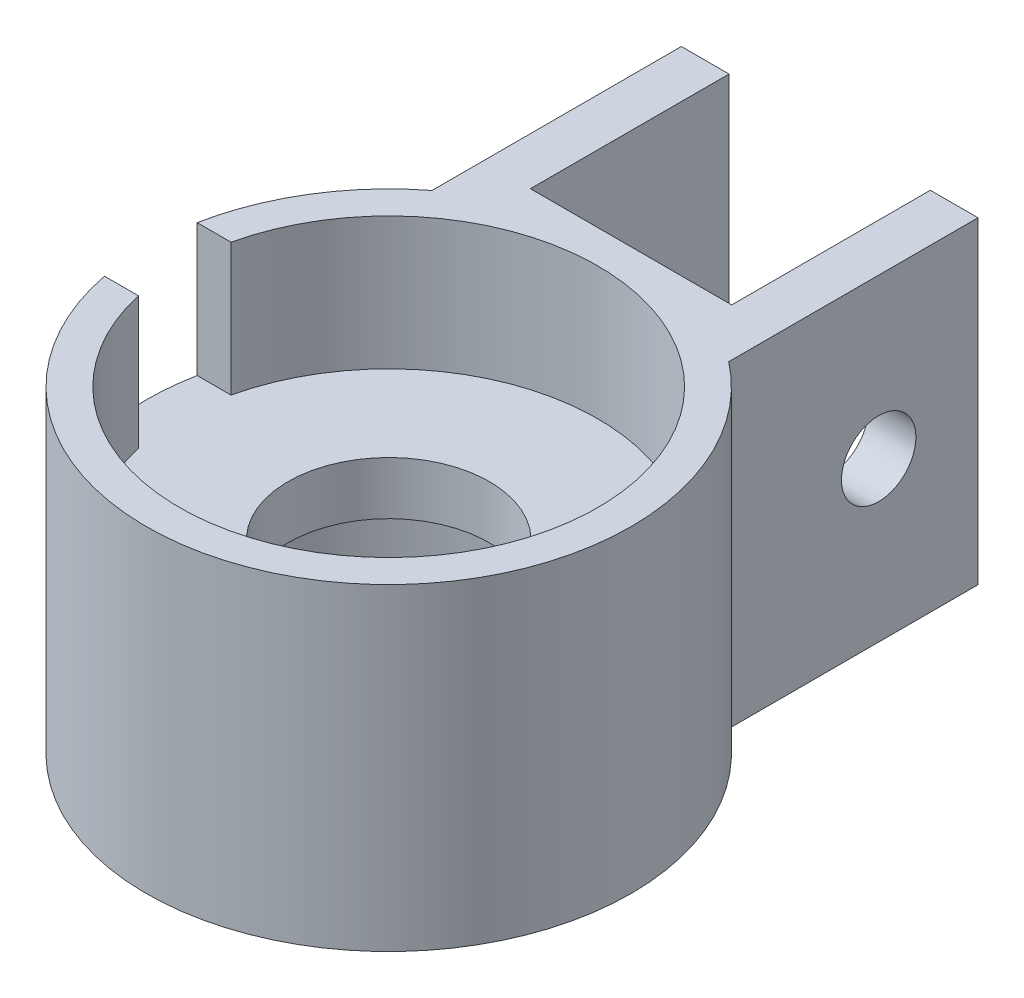
ISO-10303-21;
HEADER;
FILE_DESCRIPTION(('STEP AP214'),'2;1');
FILE_NAME('part.step','',(''),(''),'','','');
FILE_SCHEMA(('AUTOMOTIVE_DESIGN { 1 0 10303 214 1 1 1 1 }'));
ENDSEC;
DATA;
#1=APPLICATION_CONTEXT('core data for automotive mechanical design processes');
#2=APPLICATION_PROTOCOL_DEFINITION('international standard','automotive_design',2000,#1);
#3=PRODUCT_CONTEXT('',#1,'mechanical');
#4=PRODUCT('Part','Part','',(#3));
#5=PRODUCT_RELATED_PRODUCT_CATEGORY('part','',(#4));
#6=PRODUCT_DEFINITION_FORMATION('','',#4);
#7=PRODUCT_DEFINITION_CONTEXT('part definition',#1,'design');
#8=PRODUCT_DEFINITION('design','',#6,#7);
#9=PRODUCT_DEFINITION_SHAPE('','',#8);
#10=(LENGTH_UNIT() NAMED_UNIT(*) SI_UNIT(.MILLI.,.METRE.));
#11=(NAMED_UNIT(*) PLANE_ANGLE_UNIT() SI_UNIT($,.RADIAN.));
#12=(NAMED_UNIT(*) SI_UNIT($,.STERADIAN.) SOLID_ANGLE_UNIT());
#13=UNCERTAINTY_MEASURE_WITH_UNIT(LENGTH_MEASURE(1.E-05),#10,'distance_accuracy_value','');
#14=(GEOMETRIC_REPRESENTATION_CONTEXT(3) GLOBAL_UNCERTAINTY_ASSIGNED_CONTEXT((#13)) GLOBAL_UNIT_ASSIGNED_CONTEXT((#10,
#11,#12)) REPRESENTATION_CONTEXT('',''));
#15=CARTESIAN_POINT('',(0.,0.,0.));
#16=DIRECTION('',(0.,0.,1.));
#17=DIRECTION('',(1.,0.,0.));
#18=AXIS2_PLACEMENT_3D('',#15,#16,#17);
#19=CARTESIAN_POINT('',(0.,5.08,0.));
#20=DIRECTION('',(0.,1.,0.));
#21=DIRECTION('',(0.,0.,1.));
#22=AXIS2_PLACEMENT_3D('',#19,#20,#21);
#23=PLANE('',#22);
#24=DIRECTION('',(-1.,0.,0.));
#25=VECTOR('',#24,1.);
#26=CARTESIAN_POINT('',(0.,5.08,4.445));
#27=LINE('',#26,#25);
#28=CARTESIAN_POINT('',(-19.5674814679866,5.07999999999997,4.445));
#29=VERTEX_POINT('',#28);
#30=CARTESIAN_POINT('',(-22.8119717692268,5.07999999999997,4.44499999999998));
#31=VERTEX_POINT('',#30);
#32=EDGE_CURVE('E268',#29,#31,#27,.T.);
#33=ORIENTED_EDGE('',*,*,#32,.F.);
#34=CARTESIAN_POINT('',(0.,5.08,0.));
#35=DIRECTION('',(0.,1.,0.));
#36=DIRECTION('',(0.,0.,1.));
#37=AXIS2_PLACEMENT_3D('',#34,#35,#36);
#38=CIRCLE('',#37,20.066);
#39=CARTESIAN_POINT('',(-19.5674814679866,5.07999999999997,-4.445));
#40=VERTEX_POINT('',#39);
#41=EDGE_CURVE('E56',#40,#29,#38,.F.);
#42=ORIENTED_EDGE('',*,*,#41,.F.);
#43=DIRECTION('',(1.,0.,0.));
#44=VECTOR('',#43,1.);
#45=CARTESIAN_POINT('',(0.,5.08,-4.445));
#46=LINE('',#45,#44);
#47=CARTESIAN_POINT('',(-22.8119717692268,5.07999999999997,-4.445));
#48=VERTEX_POINT('',#47);
#49=EDGE_CURVE('E265',#48,#40,#46,.T.);
#50=ORIENTED_EDGE('',*,*,#49,.F.);
#51=CARTESIAN_POINT('',(0.,5.08,0.));
#52=DIRECTION('',(0.,1.,0.));
#53=DIRECTION('',(0.,0.,1.));
#54=AXIS2_PLACEMENT_3D('',#51,#52,#53);
#55=CIRCLE('',#54,23.241);
#56=EDGE_CURVE('E163',#48,#31,#55,.T.);
#57=ORIENTED_EDGE('',*,*,#56,.T.);
#58=EDGE_LOOP('',(#33,#42,#50,#57));
#59=FACE_BOUND('',#58,.T.);
#60=CARTESIAN_POINT('',(0.,5.08,0.));
#61=DIRECTION('',(0.,1.,0.));
#62=DIRECTION('',(0.,0.,1.));
#63=AXIS2_PLACEMENT_3D('',#60,#61,#62);
#64=CIRCLE('',#63,9.652);
#65=CARTESIAN_POINT('',(0.,5.08,9.652));
#66=VERTEX_POINT('',#65);
#67=EDGE_CURVE('E272',#66,#66,#64,.T.);
#68=ORIENTED_EDGE('',*,*,#67,.F.);
#69=EDGE_LOOP('',(#68));
#70=FACE_BOUND('',#69,.T.);
#71=ADVANCED_FACE('F41',(#59,#70),#23,.T.);
#72=CARTESIAN_POINT('',(0.,0.,0.));
#73=DIRECTION('',(0.,1.,0.));
#74=DIRECTION('',(0.,0.,1.));
#75=AXIS2_PLACEMENT_3D('',#72,#73,#74);
#76=PLANE('',#75);
#77=CARTESIAN_POINT('',(0.,0.,0.));
#78=DIRECTION('',(0.,1.,0.));
#79=DIRECTION('',(0.,0.,1.));
#80=AXIS2_PLACEMENT_3D('',#77,#78,#79);
#81=CIRCLE('',#80,20.066);
#82=CARTESIAN_POINT('',(-19.5674814679866,0.,-4.445));
#83=VERTEX_POINT('',#82);
#84=CARTESIAN_POINT('',(-19.5674814679866,0.,4.445));
#85=VERTEX_POINT('',#84);
#86=EDGE_CURVE('E12',#83,#85,#81,.F.);
#87=ORIENTED_EDGE('',*,*,#86,.T.);
#88=DIRECTION('',(-1.,0.,0.));
#89=VECTOR('',#88,1.);
#90=CARTESIAN_POINT('',(0.,0.,4.445));
#91=LINE('',#90,#89);
#92=CARTESIAN_POINT('',(-22.8119717692268,0.,4.44499999999998));
#93=VERTEX_POINT('',#92);
#94=EDGE_CURVE('E64',#85,#93,#91,.T.);
#95=ORIENTED_EDGE('',*,*,#94,.T.);
#96=CARTESIAN_POINT('',(0.,0.,0.));
#97=DIRECTION('',(0.,1.,0.));
#98=DIRECTION('',(0.,0.,1.));
#99=AXIS2_PLACEMENT_3D('',#96,#97,#98);
#100=CIRCLE('',#99,23.241);
#101=CARTESIAN_POINT('',(-22.8119717692268,0.,-4.445));
#102=VERTEX_POINT('',#101);
#103=EDGE_CURVE('E275',#102,#93,#100,.T.);
#104=ORIENTED_EDGE('',*,*,#103,.F.);
#105=DIRECTION('',(1.,0.,0.));
#106=VECTOR('',#105,1.);
#107=CARTESIAN_POINT('',(0.,0.,-4.445));
#108=LINE('',#107,#106);
#109=EDGE_CURVE('E262',#102,#83,#108,.T.);
#110=ORIENTED_EDGE('',*,*,#109,.T.);
#111=EDGE_LOOP('',(#87,#95,#104,#110));
#112=FACE_BOUND('',#111,.T.);
#113=CARTESIAN_POINT('',(0.,0.,0.));
#114=DIRECTION('',(0.,1.,0.));
#115=DIRECTION('',(0.,0.,1.));
#116=AXIS2_PLACEMENT_3D('',#113,#114,#115);
#117=CIRCLE('',#116,9.652);
#118=CARTESIAN_POINT('',(0.,0.,9.652));
#119=VERTEX_POINT('',#118);
#120=EDGE_CURVE('E271',#119,#119,#117,.T.);
#121=ORIENTED_EDGE('',*,*,#120,.T.);
#122=EDGE_LOOP('',(#121));
#123=FACE_BOUND('',#122,.T.);
#124=ADVANCED_FACE('F344',(#112,#123),#76,.F.);
#125=CARTESIAN_POINT('',(0.,5.08,0.));
#126=DIRECTION('',(0.,-1.,0.));
#127=DIRECTION('',(0.,0.,-1.));
#128=AXIS2_PLACEMENT_3D('',#125,#126,#127);
#129=CYLINDRICAL_SURFACE('',#128,23.241);
#130=ORIENTED_EDGE('',*,*,#103,.T.);
#131=DIRECTION('',(0.,1.,0.));
#132=VECTOR('',#131,1.);
#133=CARTESIAN_POINT('',(-22.8119717692268,-105.495687978675,4.44499999999998));
#134=LINE('',#133,#132);
#135=CARTESIAN_POINT('',(-22.8119717692268,-12.7,4.445));
#136=VERTEX_POINT('',#135);
#137=EDGE_CURVE('E251',#136,#93,#134,.T.);
#138=ORIENTED_EDGE('',*,*,#137,.F.);
#139=CARTESIAN_POINT('',(0.,-12.7,0.));
#140=DIRECTION('',(0.,1.,0.));
#141=DIRECTION('',(0.,0.,1.));
#142=AXIS2_PLACEMENT_3D('',#139,#140,#141);
#143=CIRCLE('',#142,23.241);
#144=CARTESIAN_POINT('',(14.224,-12.7,-18.379932127187));
#145=VERTEX_POINT('',#144);
#146=EDGE_CURVE('E219',#145,#136,#143,.F.);
#147=ORIENTED_EDGE('',*,*,#146,.F.);
#148=DIRECTION('',(0.,-1.,0.));
#149=VECTOR('',#148,1.);
#150=CARTESIAN_POINT('',(14.224,5.08,-18.379932127187));
#151=LINE('',#150,#149);
#152=CARTESIAN_POINT('',(14.224,17.78,-18.379932127187));
#153=VERTEX_POINT('',#152);
#154=EDGE_CURVE('E279',#145,#153,#151,.F.);
#155=ORIENTED_EDGE('',*,*,#154,.T.);
#156=CARTESIAN_POINT('',(0.,17.78,0.));
#157=DIRECTION('',(0.,1.,0.));
#158=DIRECTION('',(0.,0.,1.));
#159=AXIS2_PLACEMENT_3D('',#156,#157,#158);
#160=CIRCLE('',#159,23.241);
#161=CARTESIAN_POINT('',(-22.8119717692268,17.78,4.44499999999998));
#162=VERTEX_POINT('',#161);
#163=EDGE_CURVE('E193',#162,#153,#160,.T.);
#164=ORIENTED_EDGE('',*,*,#163,.F.);
#165=EDGE_CURVE('E253',#31,#162,#134,.T.);
#166=ORIENTED_EDGE('',*,*,#165,.F.);
#167=ORIENTED_EDGE('',*,*,#56,.F.);
#168=DIRECTION('',(0.,1.,0.));
#169=VECTOR('',#168,1.);
#170=CARTESIAN_POINT('',(-22.8119717692268,-105.495687978675,-4.445));
#171=LINE('',#170,#169);
#172=CARTESIAN_POINT('',(-22.8119717692268,17.78,-4.445));
#173=VERTEX_POINT('',#172);
#174=EDGE_CURVE('E156',#48,#173,#171,.T.);
#175=ORIENTED_EDGE('',*,*,#174,.T.);
#176=CARTESIAN_POINT('',(0.,17.78,0.));
#177=DIRECTION('',(0.,1.,0.));
#178=DIRECTION('',(0.,0.,1.));
#179=AXIS2_PLACEMENT_3D('',#176,#177,#178);
#180=CIRCLE('',#179,23.241);
#181=CARTESIAN_POINT('',(-14.224,17.78,-18.379932127187));
#182=VERTEX_POINT('',#181);
#183=EDGE_CURVE('E160',#182,#173,#180,.T.);
#184=ORIENTED_EDGE('',*,*,#183,.F.);
#185=DIRECTION('',(0.,-1.,0.));
#186=VECTOR('',#185,1.);
#187=CARTESIAN_POINT('',(-14.224,5.08,-18.379932127187));
#188=LINE('',#187,#186);
#189=CARTESIAN_POINT('',(-14.224,-12.7,-18.379932127187));
#190=VERTEX_POINT('',#189);
#191=EDGE_CURVE('E49',#182,#190,#188,.T.);
#192=ORIENTED_EDGE('',*,*,#191,.T.);
#193=CARTESIAN_POINT('',(0.,-12.7,0.));
#194=DIRECTION('',(0.,1.,0.));
#195=DIRECTION('',(0.,0.,1.));
#196=AXIS2_PLACEMENT_3D('',#193,#194,#195);
#197=CIRCLE('',#196,23.241);
#198=CARTESIAN_POINT('',(-22.8119717692268,-12.7,-4.445));
#199=VERTEX_POINT('',#198);
#200=EDGE_CURVE('E236',#199,#190,#197,.F.);
#201=ORIENTED_EDGE('',*,*,#200,.F.);
#202=EDGE_CURVE('E166',#199,#102,#171,.T.);
#203=ORIENTED_EDGE('',*,*,#202,.T.);
#204=EDGE_LOOP('',(#130,#138,#147,#155,#164,#166,#167,#175,#184,#192,#201,#203));
#205=FACE_BOUND('',#204,.T.);
#206=ADVANCED_FACE('F43',(#205),#129,.T.);
#207=CARTESIAN_POINT('',(0.,5.08,0.));
#208=DIRECTION('',(0.,-1.,0.));
#209=DIRECTION('',(0.,0.,-1.));
#210=AXIS2_PLACEMENT_3D('',#207,#208,#209);
#211=CYLINDRICAL_SURFACE('',#210,9.652);
#212=ORIENTED_EDGE('',*,*,#67,.T.);
#213=EDGE_LOOP('',(#212));
#214=FACE_BOUND('',#213,.T.);
#215=ORIENTED_EDGE('',*,*,#120,.F.);
#216=EDGE_LOOP('',(#215));
#217=FACE_BOUND('',#216,.T.);
#218=ADVANCED_FACE('F341',(#214,#217),#211,.F.);
#219=CARTESIAN_POINT('',(0.,-105.495687978675,0.));
#220=DIRECTION('',(0.,1.,0.));
#221=DIRECTION('',(0.,0.,1.));
#222=AXIS2_PLACEMENT_3D('',#219,#220,#221);
#223=CYLINDRICAL_SURFACE('',#222,20.066);
#224=ORIENTED_EDGE('',*,*,#86,.F.);
#225=DIRECTION('',(0.,1.,0.));
#226=VECTOR('',#225,1.);
#227=CARTESIAN_POINT('',(-19.5674814679866,-105.495687978675,-4.445));
#228=LINE('',#227,#226);
#229=CARTESIAN_POINT('',(-19.5674814679866,-12.7,-4.445));
#230=VERTEX_POINT('',#229);
#231=EDGE_CURVE('E257',#230,#83,#228,.T.);
#232=ORIENTED_EDGE('',*,*,#231,.F.);
#233=CARTESIAN_POINT('',(0.,-12.7,0.));
#234=DIRECTION('',(0.,1.,0.));
#235=DIRECTION('',(0.,0.,1.));
#236=AXIS2_PLACEMENT_3D('',#233,#234,#235);
#237=CIRCLE('',#236,20.066);
#238=CARTESIAN_POINT('',(-19.5674814679866,-12.7,4.445));
#239=VERTEX_POINT('',#238);
#240=EDGE_CURVE('E214',#239,#230,#237,.T.);
#241=ORIENTED_EDGE('',*,*,#240,.F.);
#242=DIRECTION('',(0.,1.,0.));
#243=VECTOR('',#242,1.);
#244=CARTESIAN_POINT('',(-19.5674814679866,-105.495687978675,4.445));
#245=LINE('',#244,#243);
#246=EDGE_CURVE('E254',#239,#85,#245,.T.);
#247=ORIENTED_EDGE('',*,*,#246,.T.);
#248=EDGE_LOOP('',(#224,#232,#241,#247));
#249=FACE_BOUND('',#248,.T.);
#250=ADVANCED_FACE('F331',(#249),#223,.F.);
#251=CARTESIAN_POINT('',(-22.8119717692268,-105.495687978675,4.445));
#252=DIRECTION('',(0.,0.,-1.));
#253=DIRECTION('',(-1.,0.,0.));
#254=AXIS2_PLACEMENT_3D('',#251,#252,#253);
#255=PLANE('',#254);
#256=ORIENTED_EDGE('',*,*,#94,.F.);
#257=ORIENTED_EDGE('',*,*,#246,.F.);
#258=DIRECTION('',(1.,0.,0.));
#259=VECTOR('',#258,1.);
#260=CARTESIAN_POINT('',(-22.8119717692268,-12.7,4.445));
#261=LINE('',#260,#259);
#262=EDGE_CURVE('E216',#136,#239,#261,.T.);
#263=ORIENTED_EDGE('',*,*,#262,.F.);
#264=ORIENTED_EDGE('',*,*,#137,.T.);
#265=EDGE_LOOP('',(#256,#257,#263,#264));
#266=FACE_BOUND('',#265,.T.);
#267=ADVANCED_FACE('F339',(#266),#255,.T.);
#268=CARTESIAN_POINT('',(-22.8119717692268,-105.495687978675,-4.445));
#269=DIRECTION('',(0.,0.,1.));
#270=DIRECTION('',(1.,0.,0.));
#271=AXIS2_PLACEMENT_3D('',#268,#269,#270);
#272=PLANE('',#271);
#273=ORIENTED_EDGE('',*,*,#109,.F.);
#274=ORIENTED_EDGE('',*,*,#202,.F.);
#275=DIRECTION('',(-1.,0.,0.));
#276=VECTOR('',#275,1.);
#277=CARTESIAN_POINT('',(-22.8119717692268,-12.7,-4.445));
#278=LINE('',#277,#276);
#279=EDGE_CURVE('E239',#230,#199,#278,.T.);
#280=ORIENTED_EDGE('',*,*,#279,.F.);
#281=ORIENTED_EDGE('',*,*,#231,.T.);
#282=EDGE_LOOP('',(#273,#274,#280,#281));
#283=FACE_BOUND('',#282,.T.);
#284=ADVANCED_FACE('F337',(#283),#272,.T.);
#285=CARTESIAN_POINT('',(-14.224,-105.495687978675,-18.379932127187));
#286=DIRECTION('',(-1.,0.,0.));
#287=DIRECTION('',(0.,0.,1.));
#288=AXIS2_PLACEMENT_3D('',#285,#286,#287);
#289=PLANE('',#288);
#290=CARTESIAN_POINT('',(-14.224,2.54,-32.766));
#291=DIRECTION('',(-1.,0.,0.));
#292=DIRECTION('',(0.,0.,1.));
#293=AXIS2_PLACEMENT_3D('',#290,#291,#292);
#294=CIRCLE('',#293,3.57123999999999);
#295=CARTESIAN_POINT('',(-14.224,2.54,-29.19476));
#296=VERTEX_POINT('',#295);
#297=EDGE_CURVE('E182',#296,#296,#294,.T.);
#298=ORIENTED_EDGE('',*,*,#297,.F.);
#299=EDGE_LOOP('',(#298));
#300=FACE_BOUND('',#299,.T.);
#301=DIRECTION('',(0.,0.,-1.));
#302=VECTOR('',#301,1.);
#303=CARTESIAN_POINT('',(-14.224,-12.7,-18.379932127187));
#304=LINE('',#303,#302);
#305=CARTESIAN_POINT('',(-14.224,-12.7,-42.291));
#306=VERTEX_POINT('',#305);
#307=EDGE_CURVE('E234',#190,#306,#304,.T.);
#308=ORIENTED_EDGE('',*,*,#307,.F.);
#309=ORIENTED_EDGE('',*,*,#191,.F.);
#310=DIRECTION('',(0.,0.,1.));
#311=VECTOR('',#310,1.);
#312=CARTESIAN_POINT('',(-14.224,17.78,-18.379932127187));
#313=LINE('',#312,#311);
#314=CARTESIAN_POINT('',(-14.224,17.78,-42.291));
#315=VERTEX_POINT('',#314);
#316=EDGE_CURVE('E167',#315,#182,#313,.T.);
#317=ORIENTED_EDGE('',*,*,#316,.F.);
#318=DIRECTION('',(0.,1.,0.));
#319=VECTOR('',#318,1.);
#320=CARTESIAN_POINT('',(-14.224,-105.495687978675,-42.291));
#321=LINE('',#320,#319);
#322=EDGE_CURVE('E217',#306,#315,#321,.T.);
#323=ORIENTED_EDGE('',*,*,#322,.F.);
#324=EDGE_LOOP('',(#308,#309,#317,#323));
#325=FACE_BOUND('',#324,.T.);
#326=ADVANCED_FACE('F290',(#300,#325),#289,.T.);
#327=CARTESIAN_POINT('',(-14.224,-105.495687978675,-42.291));
#328=DIRECTION('',(0.,0.,-1.));
#329=DIRECTION('',(-1.,0.,0.));
#330=AXIS2_PLACEMENT_3D('',#327,#328,#329);
#331=PLANE('',#330);
#332=DIRECTION('',(1.,0.,0.));
#333=VECTOR('',#332,1.);
#334=CARTESIAN_POINT('',(-14.224,-12.7,-42.291));
#335=LINE('',#334,#333);
#336=CARTESIAN_POINT('',(-9.652,-12.7,-42.291));
#337=VERTEX_POINT('',#336);
#338=EDGE_CURVE('E232',#306,#337,#335,.T.);
#339=ORIENTED_EDGE('',*,*,#338,.F.);
#340=ORIENTED_EDGE('',*,*,#322,.T.);
#341=DIRECTION('',(-1.,0.,0.));
#342=VECTOR('',#341,1.);
#343=CARTESIAN_POINT('',(-14.224,17.78,-42.291));
#344=LINE('',#343,#342);
#345=CARTESIAN_POINT('',(-9.652,17.78,-42.291));
#346=VERTEX_POINT('',#345);
#347=EDGE_CURVE('E211',#346,#315,#344,.T.);
#348=ORIENTED_EDGE('',*,*,#347,.F.);
#349=DIRECTION('',(0.,1.,0.));
#350=VECTOR('',#349,1.);
#351=CARTESIAN_POINT('',(-9.652,-105.495687978675,-42.291));
#352=LINE('',#351,#350);
#353=EDGE_CURVE('E241',#337,#346,#352,.T.);
#354=ORIENTED_EDGE('',*,*,#353,.F.);
#355=EDGE_LOOP('',(#339,#340,#348,#354));
#356=FACE_BOUND('',#355,.T.);
#357=ADVANCED_FACE('F293',(#356),#331,.T.);
#358=CARTESIAN_POINT('',(-9.652,-105.495687978675,-42.291));
#359=DIRECTION('',(1.,0.,0.));
#360=DIRECTION('',(0.,0.,-1.));
#361=AXIS2_PLACEMENT_3D('',#358,#359,#360);
#362=PLANE('',#361);
#363=CARTESIAN_POINT('',(-9.652,2.54,-32.766));
#364=DIRECTION('',(1.,0.,0.));
#365=DIRECTION('',(0.,0.,-1.));
#366=AXIS2_PLACEMENT_3D('',#363,#364,#365);
#367=CIRCLE('',#366,3.57123999999999);
#368=CARTESIAN_POINT('',(-9.652,2.54,-36.33724));
#369=VERTEX_POINT('',#368);
#370=EDGE_CURVE('E185',#369,#369,#367,.T.);
#371=ORIENTED_EDGE('',*,*,#370,.F.);
#372=EDGE_LOOP('',(#371));
#373=FACE_BOUND('',#372,.T.);
#374=DIRECTION('',(0.,0.,1.));
#375=VECTOR('',#374,1.);
#376=CARTESIAN_POINT('',(-9.652,-12.7,-42.291));
#377=LINE('',#376,#375);
#378=CARTESIAN_POINT('',(-9.652,-12.7,-23.241));
#379=VERTEX_POINT('',#378);
#380=EDGE_CURVE('E230',#337,#379,#377,.T.);
#381=ORIENTED_EDGE('',*,*,#380,.F.);
#382=ORIENTED_EDGE('',*,*,#353,.T.);
#383=DIRECTION('',(0.,0.,-1.));
#384=VECTOR('',#383,1.);
#385=CARTESIAN_POINT('',(-9.652,17.78,-42.291));
#386=LINE('',#385,#384);
#387=CARTESIAN_POINT('',(-9.652,17.78,-23.241));
#388=VERTEX_POINT('',#387);
#389=EDGE_CURVE('E208',#388,#346,#386,.T.);
#390=ORIENTED_EDGE('',*,*,#389,.F.);
#391=DIRECTION('',(0.,1.,0.));
#392=VECTOR('',#391,1.);
#393=CARTESIAN_POINT('',(-9.652,-105.495687978675,-23.241));
#394=LINE('',#393,#392);
#395=EDGE_CURVE('E243',#379,#388,#394,.T.);
#396=ORIENTED_EDGE('',*,*,#395,.F.);
#397=EDGE_LOOP('',(#381,#382,#390,#396));
#398=FACE_BOUND('',#397,.T.);
#399=ADVANCED_FACE('F300',(#373,#398),#362,.T.);
#400=CARTESIAN_POINT('',(-9.652,-105.495687978675,-23.241));
#401=DIRECTION('',(0.,0.,-1.));
#402=DIRECTION('',(-1.,0.,0.));
#403=AXIS2_PLACEMENT_3D('',#400,#401,#402);
#404=PLANE('',#403);
#405=DIRECTION('',(1.,0.,0.));
#406=VECTOR('',#405,1.);
#407=CARTESIAN_POINT('',(-9.652,-12.7,-23.241));
#408=LINE('',#407,#406);
#409=CARTESIAN_POINT('',(9.652,-12.7,-23.241));
#410=VERTEX_POINT('',#409);
#411=EDGE_CURVE('E228',#379,#410,#408,.T.);
#412=ORIENTED_EDGE('',*,*,#411,.F.);
#413=ORIENTED_EDGE('',*,*,#395,.T.);
#414=DIRECTION('',(-1.,0.,0.));
#415=VECTOR('',#414,1.);
#416=CARTESIAN_POINT('',(-9.652,17.78,-23.241));
#417=LINE('',#416,#415);
#418=CARTESIAN_POINT('',(9.652,17.78,-23.241));
#419=VERTEX_POINT('',#418);
#420=EDGE_CURVE('E205',#419,#388,#417,.T.);
#421=ORIENTED_EDGE('',*,*,#420,.F.);
#422=DIRECTION('',(0.,1.,0.));
#423=VECTOR('',#422,1.);
#424=CARTESIAN_POINT('',(9.652,-105.495687978675,-23.241));
#425=LINE('',#424,#423);
#426=EDGE_CURVE('E245',#410,#419,#425,.T.);
#427=ORIENTED_EDGE('',*,*,#426,.F.);
#428=EDGE_LOOP('',(#412,#413,#421,#427));
#429=FACE_BOUND('',#428,.T.);
#430=ADVANCED_FACE('F305',(#429),#404,.T.);
#431=CARTESIAN_POINT('',(9.652,-105.495687978675,-23.241));
#432=DIRECTION('',(-1.,0.,0.));
#433=DIRECTION('',(0.,0.,1.));
#434=AXIS2_PLACEMENT_3D('',#431,#432,#433);
#435=PLANE('',#434);
#436=CARTESIAN_POINT('',(9.652,2.54,-32.766));
#437=DIRECTION('',(-1.,0.,0.));
#438=DIRECTION('',(0.,0.,1.));
#439=AXIS2_PLACEMENT_3D('',#436,#437,#438);
#440=CIRCLE('',#439,3.57123999999999);
#441=CARTESIAN_POINT('',(9.652,2.54,-29.19476));
#442=VERTEX_POINT('',#441);
#443=EDGE_CURVE('E488',#442,#442,#440,.T.);
#444=ORIENTED_EDGE('',*,*,#443,.F.);
#445=EDGE_LOOP('',(#444));
#446=FACE_BOUND('',#445,.T.);
#447=DIRECTION('',(0.,0.,-1.));
#448=VECTOR('',#447,1.);
#449=CARTESIAN_POINT('',(9.652,-12.7,-23.241));
#450=LINE('',#449,#448);
#451=CARTESIAN_POINT('',(9.652,-12.7,-42.291));
#452=VERTEX_POINT('',#451);
#453=EDGE_CURVE('E226',#410,#452,#450,.T.);
#454=ORIENTED_EDGE('',*,*,#453,.F.);
#455=ORIENTED_EDGE('',*,*,#426,.T.);
#456=DIRECTION('',(0.,0.,1.));
#457=VECTOR('',#456,1.);
#458=CARTESIAN_POINT('',(9.652,17.78,-23.241));
#459=LINE('',#458,#457);
#460=CARTESIAN_POINT('',(9.652,17.78,-42.291));
#461=VERTEX_POINT('',#460);
#462=EDGE_CURVE('E202',#461,#419,#459,.T.);
#463=ORIENTED_EDGE('',*,*,#462,.F.);
#464=DIRECTION('',(0.,1.,0.));
#465=VECTOR('',#464,1.);
#466=CARTESIAN_POINT('',(9.652,-105.495687978675,-42.291));
#467=LINE('',#466,#465);
#468=EDGE_CURVE('E247',#452,#461,#467,.T.);
#469=ORIENTED_EDGE('',*,*,#468,.F.);
#470=EDGE_LOOP('',(#454,#455,#463,#469));
#471=FACE_BOUND('',#470,.T.);
#472=ADVANCED_FACE('F308',(#446,#471),#435,.T.);
#473=CARTESIAN_POINT('',(9.652,-105.495687978675,-42.291));
#474=DIRECTION('',(0.,0.,-1.));
#475=DIRECTION('',(-1.,0.,0.));
#476=AXIS2_PLACEMENT_3D('',#473,#474,#475);
#477=PLANE('',#476);
#478=DIRECTION('',(1.,0.,0.));
#479=VECTOR('',#478,1.);
#480=CARTESIAN_POINT('',(9.652,-12.7,-42.291));
#481=LINE('',#480,#479);
#482=CARTESIAN_POINT('',(14.224,-12.7,-42.291));
#483=VERTEX_POINT('',#482);
#484=EDGE_CURVE('E224',#452,#483,#481,.T.);
#485=ORIENTED_EDGE('',*,*,#484,.F.);
#486=ORIENTED_EDGE('',*,*,#468,.T.);
#487=DIRECTION('',(-1.,0.,0.));
#488=VECTOR('',#487,1.);
#489=CARTESIAN_POINT('',(9.652,17.78,-42.291));
#490=LINE('',#489,#488);
#491=CARTESIAN_POINT('',(14.224,17.78,-42.291));
#492=VERTEX_POINT('',#491);
#493=EDGE_CURVE('E199',#492,#461,#490,.T.);
#494=ORIENTED_EDGE('',*,*,#493,.F.);
#495=DIRECTION('',(0.,1.,0.));
#496=VECTOR('',#495,1.);
#497=CARTESIAN_POINT('',(14.224,-105.495687978675,-42.291));
#498=LINE('',#497,#496);
#499=EDGE_CURVE('E249',#483,#492,#498,.T.);
#500=ORIENTED_EDGE('',*,*,#499,.F.);
#501=EDGE_LOOP('',(#485,#486,#494,#500));
#502=FACE_BOUND('',#501,.T.);
#503=ADVANCED_FACE('F315',(#502),#477,.T.);
#504=CARTESIAN_POINT('',(14.224,-105.495687978675,-42.291));
#505=DIRECTION('',(1.,0.,0.));
#506=DIRECTION('',(0.,0.,-1.));
#507=AXIS2_PLACEMENT_3D('',#504,#505,#506);
#508=PLANE('',#507);
#509=CARTESIAN_POINT('',(14.224,2.54,-32.766));
#510=DIRECTION('',(1.,0.,0.));
#511=DIRECTION('',(0.,0.,-1.));
#512=AXIS2_PLACEMENT_3D('',#509,#510,#511);
#513=CIRCLE('',#512,3.57123999999999);
#514=CARTESIAN_POINT('',(14.224,2.54,-36.33724));
#515=VERTEX_POINT('',#514);
#516=EDGE_CURVE('E486',#515,#515,#513,.T.);
#517=ORIENTED_EDGE('',*,*,#516,.F.);
#518=EDGE_LOOP('',(#517));
#519=FACE_BOUND('',#518,.T.);
#520=DIRECTION('',(0.,0.,1.));
#521=VECTOR('',#520,1.);
#522=CARTESIAN_POINT('',(14.224,-12.7,-42.291));
#523=LINE('',#522,#521);
#524=EDGE_CURVE('E221',#483,#145,#523,.T.);
#525=ORIENTED_EDGE('',*,*,#524,.F.);
#526=ORIENTED_EDGE('',*,*,#499,.T.);
#527=DIRECTION('',(0.,0.,-1.));
#528=VECTOR('',#527,1.);
#529=CARTESIAN_POINT('',(14.224,17.78,-42.291));
#530=LINE('',#529,#528);
#531=EDGE_CURVE('E196',#153,#492,#530,.T.);
#532=ORIENTED_EDGE('',*,*,#531,.F.);
#533=ORIENTED_EDGE('',*,*,#154,.F.);
#534=EDGE_LOOP('',(#525,#526,#532,#533));
#535=FACE_BOUND('',#534,.T.);
#536=ADVANCED_FACE('F319',(#519,#535),#508,.T.);
#537=CARTESIAN_POINT('',(-19.5674814679866,17.78,4.445));
#538=VERTEX_POINT('',#537);
#539=EDGE_CURVE('E256',#29,#538,#245,.T.);
#540=ORIENTED_EDGE('',*,*,#539,.F.);
#541=ORIENTED_EDGE('',*,*,#32,.T.);
#542=ORIENTED_EDGE('',*,*,#165,.T.);
#543=DIRECTION('',(-1.,0.,0.));
#544=VECTOR('',#543,1.);
#545=CARTESIAN_POINT('',(-22.8119717692268,17.78,4.445));
#546=LINE('',#545,#544);
#547=EDGE_CURVE('E190',#538,#162,#546,.T.);
#548=ORIENTED_EDGE('',*,*,#547,.F.);
#549=EDGE_LOOP('',(#540,#541,#542,#548));
#550=FACE_BOUND('',#549,.T.);
#551=ADVANCED_FACE('F324',(#550),#255,.T.);
#552=CARTESIAN_POINT('',(-19.5674814679866,17.78,-4.445));
#553=VERTEX_POINT('',#552);
#554=EDGE_CURVE('E172',#40,#553,#228,.T.);
#555=ORIENTED_EDGE('',*,*,#554,.F.);
#556=ORIENTED_EDGE('',*,*,#41,.T.);
#557=ORIENTED_EDGE('',*,*,#539,.T.);
#558=CARTESIAN_POINT('',(0.,17.78,0.));
#559=DIRECTION('',(0.,-1.,0.));
#560=DIRECTION('',(0.,0.,1.));
#561=AXIS2_PLACEMENT_3D('',#558,#559,#560);
#562=CIRCLE('',#561,20.066);
#563=EDGE_CURVE('E176',#553,#538,#562,.T.);
#564=ORIENTED_EDGE('',*,*,#563,.F.);
#565=EDGE_LOOP('',(#555,#556,#557,#564));
#566=FACE_BOUND('',#565,.T.);
#567=ADVANCED_FACE('F328',(#566),#223,.F.);
#568=ORIENTED_EDGE('',*,*,#174,.F.);
#569=ORIENTED_EDGE('',*,*,#49,.T.);
#570=ORIENTED_EDGE('',*,*,#554,.T.);
#571=DIRECTION('',(1.,0.,0.));
#572=VECTOR('',#571,1.);
#573=CARTESIAN_POINT('',(-22.8119717692268,17.78,-4.445));
#574=LINE('',#573,#572);
#575=EDGE_CURVE('E170',#173,#553,#574,.T.);
#576=ORIENTED_EDGE('',*,*,#575,.F.);
#577=EDGE_LOOP('',(#568,#569,#570,#576));
#578=FACE_BOUND('',#577,.T.);
#579=ADVANCED_FACE('F171',(#578),#272,.T.);
#580=CARTESIAN_POINT('',(0.,-12.7,0.));
#581=DIRECTION('',(0.,1.,0.));
#582=DIRECTION('',(0.,0.,1.));
#583=AXIS2_PLACEMENT_3D('',#580,#581,#582);
#584=PLANE('',#583);
#585=ORIENTED_EDGE('',*,*,#200,.T.);
#586=ORIENTED_EDGE('',*,*,#307,.T.);
#587=ORIENTED_EDGE('',*,*,#338,.T.);
#588=ORIENTED_EDGE('',*,*,#380,.T.);
#589=ORIENTED_EDGE('',*,*,#411,.T.);
#590=ORIENTED_EDGE('',*,*,#453,.T.);
#591=ORIENTED_EDGE('',*,*,#484,.T.);
#592=ORIENTED_EDGE('',*,*,#524,.T.);
#593=ORIENTED_EDGE('',*,*,#146,.T.);
#594=ORIENTED_EDGE('',*,*,#262,.T.);
#595=ORIENTED_EDGE('',*,*,#240,.T.);
#596=ORIENTED_EDGE('',*,*,#279,.T.);
#597=EDGE_LOOP('',(#585,#586,#587,#588,#589,#590,#591,#592,#593,#594,#595,#596));
#598=FACE_BOUND('',#597,.T.);
#599=ADVANCED_FACE('F286',(#598),#584,.F.);
#600=CARTESIAN_POINT('',(0.,17.78,0.));
#601=DIRECTION('',(0.,1.,0.));
#602=DIRECTION('',(0.,0.,1.));
#603=AXIS2_PLACEMENT_3D('',#600,#601,#602);
#604=PLANE('',#603);
#605=ORIENTED_EDGE('',*,*,#183,.T.);
#606=ORIENTED_EDGE('',*,*,#575,.T.);
#607=ORIENTED_EDGE('',*,*,#563,.T.);
#608=ORIENTED_EDGE('',*,*,#547,.T.);
#609=ORIENTED_EDGE('',*,*,#163,.T.);
#610=ORIENTED_EDGE('',*,*,#531,.T.);
#611=ORIENTED_EDGE('',*,*,#493,.T.);
#612=ORIENTED_EDGE('',*,*,#462,.T.);
#613=ORIENTED_EDGE('',*,*,#420,.T.);
#614=ORIENTED_EDGE('',*,*,#389,.T.);
#615=ORIENTED_EDGE('',*,*,#347,.T.);
#616=ORIENTED_EDGE('',*,*,#316,.T.);
#617=EDGE_LOOP('',(#605,#606,#607,#608,#609,#610,#611,#612,#613,#614,#615,#616));
#618=FACE_BOUND('',#617,.T.);
#619=ADVANCED_FACE('F179',(#618),#604,.T.);
#620=CARTESIAN_POINT('',(14.224,2.54,-32.766));
#621=DIRECTION('',(1.,0.,0.));
#622=DIRECTION('',(0.,0.,-1.));
#623=AXIS2_PLACEMENT_3D('',#620,#621,#622);
#624=CYLINDRICAL_SURFACE('',#623,3.57123999999999);
#625=ORIENTED_EDGE('',*,*,#443,.T.);
#626=EDGE_LOOP('',(#625));
#627=FACE_BOUND('',#626,.T.);
#628=ORIENTED_EDGE('',*,*,#516,.T.);
#629=EDGE_LOOP('',(#628));
#630=FACE_BOUND('',#629,.T.);
#631=ADVANCED_FACE('F447',(#627,#630),#624,.F.);
#632=ORIENTED_EDGE('',*,*,#297,.T.);
#633=EDGE_LOOP('',(#632));
#634=FACE_BOUND('',#633,.T.);
#635=ORIENTED_EDGE('',*,*,#370,.T.);
#636=EDGE_LOOP('',(#635));
#637=FACE_BOUND('',#636,.T.);
#638=ADVANCED_FACE('F460',(#634,#637),#624,.F.);
#639=CLOSED_SHELL('',(#71,#124,#206,#218,#250,#267,#284,#326,#357,#399,#430,#472,#503,#536,#551,
#567,#579,#599,#619,#631,#638));
#640=MANIFOLD_SOLID_BREP('B2',#639);
#641=ADVANCED_BREP_SHAPE_REPRESENTATION('',(#18,#640),#14);
#642=SHAPE_DEFINITION_REPRESENTATION(#9,#641);
ENDSEC;
END-ISO-10303-21;
